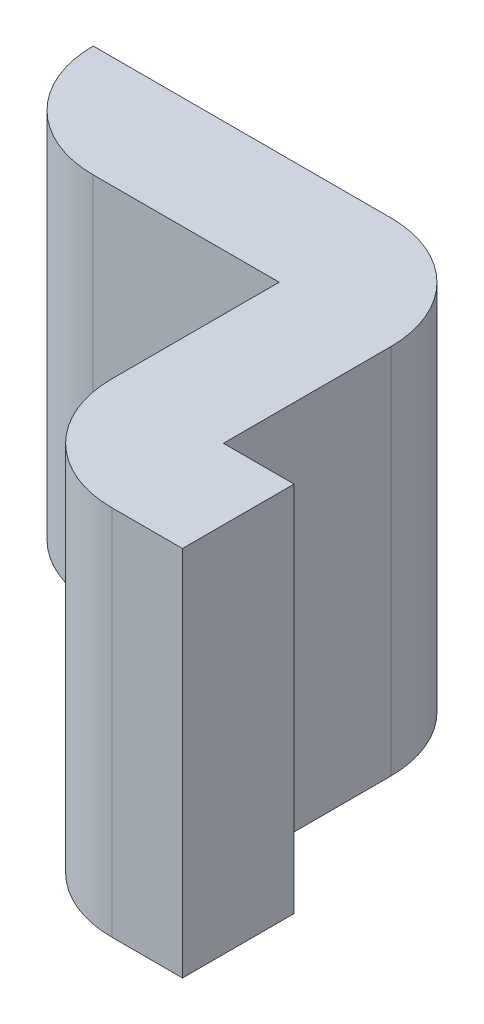
ISO-10303-21;
HEADER;
FILE_DESCRIPTION(('STEP AP214'),'2;1');
FILE_NAME('part.step','',(''),(''),'','','');
FILE_SCHEMA(('AUTOMOTIVE_DESIGN { 1 0 10303 214 1 1 1 1 }'));
ENDSEC;
DATA;
#1=APPLICATION_CONTEXT('core data for automotive mechanical design processes');
#2=APPLICATION_PROTOCOL_DEFINITION('international standard','automotive_design',2000,#1);
#3=PRODUCT_CONTEXT('',#1,'mechanical');
#4=PRODUCT('Part','Part','',(#3));
#5=PRODUCT_RELATED_PRODUCT_CATEGORY('part','',(#4));
#6=PRODUCT_DEFINITION_FORMATION('','',#4);
#7=PRODUCT_DEFINITION_CONTEXT('part definition',#1,'design');
#8=PRODUCT_DEFINITION('design','',#6,#7);
#9=PRODUCT_DEFINITION_SHAPE('','',#8);
#10=(LENGTH_UNIT() NAMED_UNIT(*) SI_UNIT(.MILLI.,.METRE.));
#11=(NAMED_UNIT(*) PLANE_ANGLE_UNIT() SI_UNIT($,.RADIAN.));
#12=(NAMED_UNIT(*) SI_UNIT($,.STERADIAN.) SOLID_ANGLE_UNIT());
#13=UNCERTAINTY_MEASURE_WITH_UNIT(LENGTH_MEASURE(1.E-05),#10,'distance_accuracy_value','');
#14=(GEOMETRIC_REPRESENTATION_CONTEXT(3) GLOBAL_UNCERTAINTY_ASSIGNED_CONTEXT((#13)) GLOBAL_UNIT_ASSIGNED_CONTEXT((#10,
#11,#12)) REPRESENTATION_CONTEXT('',''));
#15=CARTESIAN_POINT('',(0.,0.,0.));
#16=DIRECTION('',(0.,0.,1.));
#17=DIRECTION('',(1.,0.,0.));
#18=AXIS2_PLACEMENT_3D('',#15,#16,#17);
#19=CARTESIAN_POINT('',(1.2065,5.6642,0.9525));
#20=DIRECTION('',(-1.,0.,0.));
#21=DIRECTION('',(0.,0.,1.));
#22=AXIS2_PLACEMENT_3D('',#19,#20,#21);
#23=PLANE('',#22);
#24=DIRECTION('',(0.,-1.,0.));
#25=VECTOR('',#24,1.);
#26=CARTESIAN_POINT('',(1.2065,5.6642,0.381));
#27=LINE('',#26,#25);
#28=CARTESIAN_POINT('',(1.2065,6.9342,0.381));
#29=VERTEX_POINT('',#28);
#30=CARTESIAN_POINT('',(1.2065,5.6642,0.381));
#31=VERTEX_POINT('',#30);
#32=EDGE_CURVE('E83',#29,#31,#27,.T.);
#33=ORIENTED_EDGE('',*,*,#32,.F.);
#34=DIRECTION('',(0.,0.,-1.));
#35=VECTOR('',#34,1.);
#36=CARTESIAN_POINT('',(1.2065,6.9342,0.));
#37=LINE('',#36,#35);
#38=CARTESIAN_POINT('',(1.2065,6.9342,0.9525));
#39=VERTEX_POINT('',#38);
#40=EDGE_CURVE('E80',#29,#39,#37,.F.);
#41=ORIENTED_EDGE('',*,*,#40,.T.);
#42=DIRECTION('',(0.,1.,0.));
#43=VECTOR('',#42,1.);
#44=CARTESIAN_POINT('',(1.2065,5.6642,0.9525));
#45=LINE('',#44,#43);
#46=CARTESIAN_POINT('',(1.2065,5.6642,0.9525));
#47=VERTEX_POINT('',#46);
#48=EDGE_CURVE('E148',#39,#47,#45,.F.);
#49=ORIENTED_EDGE('',*,*,#48,.T.);
#50=DIRECTION('',(0.,0.,-1.));
#51=VECTOR('',#50,1.);
#52=CARTESIAN_POINT('',(1.2065,5.6642,0.));
#53=LINE('',#52,#51);
#54=EDGE_CURVE('E153',#31,#47,#53,.F.);
#55=ORIENTED_EDGE('',*,*,#54,.F.);
#56=EDGE_LOOP('',(#33,#41,#49,#55));
#57=FACE_BOUND('',#56,.T.);
#58=ADVANCED_FACE('F17',(#57),#23,.F.);
#59=CARTESIAN_POINT('',(1.4478,5.6642,0.9525));
#60=DIRECTION('',(0.,0.,1.));
#61=DIRECTION('',(1.,0.,0.));
#62=AXIS2_PLACEMENT_3D('',#59,#60,#61);
#63=PLANE('',#62);
#64=ORIENTED_EDGE('',*,*,#48,.F.);
#65=DIRECTION('',(1.,0.,0.));
#66=VECTOR('',#65,1.);
#67=CARTESIAN_POINT('',(-0.1905,6.9342,0.9525));
#68=LINE('',#67,#66);
#69=CARTESIAN_POINT('',(1.4478,6.9342,0.9525));
#70=VERTEX_POINT('',#69);
#71=EDGE_CURVE('E118',#39,#70,#68,.T.);
#72=ORIENTED_EDGE('',*,*,#71,.T.);
#73=DIRECTION('',(0.,1.,0.));
#74=VECTOR('',#73,1.);
#75=CARTESIAN_POINT('',(1.4478,5.6642,0.9525));
#76=LINE('',#75,#74);
#77=CARTESIAN_POINT('',(1.4478,5.6642,0.9525));
#78=VERTEX_POINT('',#77);
#79=EDGE_CURVE('E136',#70,#78,#76,.F.);
#80=ORIENTED_EDGE('',*,*,#79,.T.);
#81=DIRECTION('',(1.,0.,0.));
#82=VECTOR('',#81,1.);
#83=CARTESIAN_POINT('',(-0.1905,5.6642,0.9525));
#84=LINE('',#83,#82);
#85=EDGE_CURVE('E143',#47,#78,#84,.T.);
#86=ORIENTED_EDGE('',*,*,#85,.F.);
#87=EDGE_LOOP('',(#64,#72,#80,#86));
#88=FACE_BOUND('',#87,.T.);
#89=ADVANCED_FACE('F315',(#88),#63,.F.);
#90=CARTESIAN_POINT('',(1.4478,5.6642,1.3335));
#91=DIRECTION('',(-1.,0.,0.));
#92=DIRECTION('',(0.,0.,1.));
#93=AXIS2_PLACEMENT_3D('',#90,#91,#92);
#94=PLANE('',#93);
#95=ORIENTED_EDGE('',*,*,#79,.F.);
#96=DIRECTION('',(0.,0.,-1.));
#97=VECTOR('',#96,1.);
#98=CARTESIAN_POINT('',(1.4478,6.9342,0.));
#99=LINE('',#98,#97);
#100=CARTESIAN_POINT('',(1.4478,6.9342,1.3335));
#101=VERTEX_POINT('',#100);
#102=EDGE_CURVE('E114',#70,#101,#99,.F.);
#103=ORIENTED_EDGE('',*,*,#102,.T.);
#104=DIRECTION('',(0.,1.,0.));
#105=VECTOR('',#104,1.);
#106=CARTESIAN_POINT('',(1.4478,5.6642,1.3335));
#107=LINE('',#106,#105);
#108=CARTESIAN_POINT('',(1.4478,5.6642,1.3335));
#109=VERTEX_POINT('',#108);
#110=EDGE_CURVE('E133',#101,#109,#107,.F.);
#111=ORIENTED_EDGE('',*,*,#110,.T.);
#112=DIRECTION('',(0.,0.,-1.));
#113=VECTOR('',#112,1.);
#114=CARTESIAN_POINT('',(1.4478,5.6642,0.));
#115=LINE('',#114,#113);
#116=EDGE_CURVE('E139',#78,#109,#115,.F.);
#117=ORIENTED_EDGE('',*,*,#116,.F.);
#118=EDGE_LOOP('',(#95,#103,#111,#117));
#119=FACE_BOUND('',#118,.T.);
#120=ADVANCED_FACE('F192',(#119),#94,.F.);
#121=CARTESIAN_POINT('',(1.2065,5.6642,1.3335));
#122=DIRECTION('',(0.,0.,-1.));
#123=DIRECTION('',(-1.,0.,0.));
#124=AXIS2_PLACEMENT_3D('',#121,#122,#123);
#125=PLANE('',#124);
#126=ORIENTED_EDGE('',*,*,#110,.F.);
#127=DIRECTION('',(1.,0.,0.));
#128=VECTOR('',#127,1.);
#129=CARTESIAN_POINT('',(-0.1905,6.9342,1.3335));
#130=LINE('',#129,#128);
#131=CARTESIAN_POINT('',(1.2065,6.9342,1.3335));
#132=VERTEX_POINT('',#131);
#133=EDGE_CURVE('E111',#101,#132,#130,.F.);
#134=ORIENTED_EDGE('',*,*,#133,.T.);
#135=DIRECTION('',(0.,-1.,0.));
#136=VECTOR('',#135,1.);
#137=CARTESIAN_POINT('',(1.2065,5.6642,1.3335));
#138=LINE('',#137,#136);
#139=CARTESIAN_POINT('',(1.2065,5.6642,1.3335));
#140=VERTEX_POINT('',#139);
#141=EDGE_CURVE('E131',#140,#132,#138,.F.);
#142=ORIENTED_EDGE('',*,*,#141,.F.);
#143=DIRECTION('',(1.,0.,0.));
#144=VECTOR('',#143,1.);
#145=CARTESIAN_POINT('',(-0.1905,5.6642,1.3335));
#146=LINE('',#145,#144);
#147=EDGE_CURVE('E142',#109,#140,#146,.F.);
#148=ORIENTED_EDGE('',*,*,#147,.F.);
#149=EDGE_LOOP('',(#126,#134,#142,#148));
#150=FACE_BOUND('',#149,.T.);
#151=ADVANCED_FACE('F185',(#150),#125,.F.);
#152=CARTESIAN_POINT('',(1.2065,5.6642,0.9525));
#153=DIRECTION('',(0.,-1.,0.));
#154=DIRECTION('',(0.,0.,-1.));
#155=AXIS2_PLACEMENT_3D('',#152,#153,#154);
#156=CYLINDRICAL_SURFACE('',#155,0.381);
#157=CARTESIAN_POINT('',(1.2065,6.9342,0.9525));
#158=DIRECTION('',(0.,-1.,0.));
#159=DIRECTION('',(0.,0.,-1.));
#160=AXIS2_PLACEMENT_3D('',#157,#158,#159);
#161=CIRCLE('',#160,0.381);
#162=CARTESIAN_POINT('',(0.8255,6.9342,0.9525));
#163=VERTEX_POINT('',#162);
#164=EDGE_CURVE('E108',#132,#163,#161,.T.);
#165=ORIENTED_EDGE('',*,*,#164,.T.);
#166=DIRECTION('',(0.,1.,0.));
#167=VECTOR('',#166,1.);
#168=CARTESIAN_POINT('',(0.8255,5.6642,0.9525));
#169=LINE('',#168,#167);
#170=CARTESIAN_POINT('',(0.8255,5.6642,0.9525));
#171=VERTEX_POINT('',#170);
#172=EDGE_CURVE('E126',#163,#171,#169,.F.);
#173=ORIENTED_EDGE('',*,*,#172,.T.);
#174=CARTESIAN_POINT('',(1.2065,5.6642,0.9525));
#175=DIRECTION('',(0.,-1.,0.));
#176=DIRECTION('',(0.,0.,-1.));
#177=AXIS2_PLACEMENT_3D('',#174,#175,#176);
#178=CIRCLE('',#177,0.381);
#179=EDGE_CURVE('E169',#140,#171,#178,.T.);
#180=ORIENTED_EDGE('',*,*,#179,.F.);
#181=ORIENTED_EDGE('',*,*,#141,.T.);
#182=EDGE_LOOP('',(#165,#173,#180,#181));
#183=FACE_BOUND('',#182,.T.);
#184=ADVANCED_FACE('F176',(#183),#156,.T.);
#185=CARTESIAN_POINT('',(0.8255,5.6642,0.381));
#186=DIRECTION('',(1.,0.,0.));
#187=DIRECTION('',(0.,0.,-1.));
#188=AXIS2_PLACEMENT_3D('',#185,#186,#187);
#189=PLANE('',#188);
#190=ORIENTED_EDGE('',*,*,#172,.F.);
#191=DIRECTION('',(0.,0.,-1.));
#192=VECTOR('',#191,1.);
#193=CARTESIAN_POINT('',(0.8255,6.9342,0.));
#194=LINE('',#193,#192);
#195=CARTESIAN_POINT('',(0.8255,6.9342,0.381));
#196=VERTEX_POINT('',#195);
#197=EDGE_CURVE('E103',#163,#196,#194,.T.);
#198=ORIENTED_EDGE('',*,*,#197,.T.);
#199=DIRECTION('',(0.,1.,0.));
#200=VECTOR('',#199,1.);
#201=CARTESIAN_POINT('',(0.8255,5.6642,0.381));
#202=LINE('',#201,#200);
#203=CARTESIAN_POINT('',(0.8255,5.6642,0.381));
#204=VERTEX_POINT('',#203);
#205=EDGE_CURVE('E123',#196,#204,#202,.F.);
#206=ORIENTED_EDGE('',*,*,#205,.T.);
#207=DIRECTION('',(0.,0.,-1.));
#208=VECTOR('',#207,1.);
#209=CARTESIAN_POINT('',(0.8255,5.6642,0.));
#210=LINE('',#209,#208);
#211=EDGE_CURVE('E171',#171,#204,#210,.T.);
#212=ORIENTED_EDGE('',*,*,#211,.F.);
#213=EDGE_LOOP('',(#190,#198,#206,#212));
#214=FACE_BOUND('',#213,.T.);
#215=ADVANCED_FACE('F230',(#214),#189,.F.);
#216=CARTESIAN_POINT('',(0.1905,5.6642,0.381));
#217=DIRECTION('',(0.,0.,-1.));
#218=DIRECTION('',(-1.,0.,0.));
#219=AXIS2_PLACEMENT_3D('',#216,#217,#218);
#220=PLANE('',#219);
#221=ORIENTED_EDGE('',*,*,#205,.F.);
#222=DIRECTION('',(1.,0.,0.));
#223=VECTOR('',#222,1.);
#224=CARTESIAN_POINT('',(-0.1905,6.9342,0.381));
#225=LINE('',#224,#223);
#226=CARTESIAN_POINT('',(0.1905,6.9342,0.381));
#227=VERTEX_POINT('',#226);
#228=EDGE_CURVE('E99',#196,#227,#225,.F.);
#229=ORIENTED_EDGE('',*,*,#228,.T.);
#230=DIRECTION('',(0.,-1.,0.));
#231=VECTOR('',#230,1.);
#232=CARTESIAN_POINT('',(0.1905,5.6642,0.381));
#233=LINE('',#232,#231);
#234=CARTESIAN_POINT('',(0.1905,5.6642,0.381));
#235=VERTEX_POINT('',#234);
#236=EDGE_CURVE('E102',#235,#227,#233,.F.);
#237=ORIENTED_EDGE('',*,*,#236,.F.);
#238=DIRECTION('',(1.,0.,0.));
#239=VECTOR('',#238,1.);
#240=CARTESIAN_POINT('',(-0.1905,5.6642,0.381));
#241=LINE('',#240,#239);
#242=EDGE_CURVE('E95',#204,#235,#241,.F.);
#243=ORIENTED_EDGE('',*,*,#242,.F.);
#244=EDGE_LOOP('',(#221,#229,#237,#243));
#245=FACE_BOUND('',#244,.T.);
#246=ADVANCED_FACE('F228',(#245),#220,.F.);
#247=CARTESIAN_POINT('',(0.8255,5.6642,0.381));
#248=DIRECTION('',(0.,-1.,0.));
#249=DIRECTION('',(0.,0.,-1.));
#250=AXIS2_PLACEMENT_3D('',#247,#248,#249);
#251=CYLINDRICAL_SURFACE('',#250,0.381);
#252=CARTESIAN_POINT('',(0.8255,6.9342,0.381));
#253=DIRECTION('',(0.,-1.,0.));
#254=DIRECTION('',(0.,0.,-1.));
#255=AXIS2_PLACEMENT_3D('',#252,#253,#254);
#256=CIRCLE('',#255,0.381);
#257=CARTESIAN_POINT('',(0.8255,6.9342,0.));
#258=VERTEX_POINT('',#257);
#259=EDGE_CURVE('E20',#258,#29,#256,.T.);
#260=ORIENTED_EDGE('',*,*,#259,.T.);
#261=ORIENTED_EDGE('',*,*,#32,.T.);
#262=CARTESIAN_POINT('',(0.8255,5.6642,0.381));
#263=DIRECTION('',(0.,-1.,0.));
#264=DIRECTION('',(0.,0.,-1.));
#265=AXIS2_PLACEMENT_3D('',#262,#263,#264);
#266=CIRCLE('',#265,0.381);
#267=CARTESIAN_POINT('',(0.8255,5.6642,0.));
#268=VERTEX_POINT('',#267);
#269=EDGE_CURVE('E93',#268,#31,#266,.T.);
#270=ORIENTED_EDGE('',*,*,#269,.F.);
#271=DIRECTION('',(0.,1.,0.));
#272=VECTOR('',#271,1.);
#273=CARTESIAN_POINT('',(0.8255,5.6642,0.));
#274=LINE('',#273,#272);
#275=EDGE_CURVE('E87',#268,#258,#274,.T.);
#276=ORIENTED_EDGE('',*,*,#275,.T.);
#277=EDGE_LOOP('',(#260,#261,#270,#276));
#278=FACE_BOUND('',#277,.T.);
#279=ADVANCED_FACE('F91',(#278),#251,.T.);
#280=CARTESIAN_POINT('',(-0.1905,6.9342,0.));
#281=DIRECTION('',(0.,-1.,0.));
#282=DIRECTION('',(0.,0.,-1.));
#283=AXIS2_PLACEMENT_3D('',#280,#281,#282);
#284=PLANE('',#283);
#285=ORIENTED_EDGE('',*,*,#228,.F.);
#286=ORIENTED_EDGE('',*,*,#197,.F.);
#287=ORIENTED_EDGE('',*,*,#164,.F.);
#288=ORIENTED_EDGE('',*,*,#133,.F.);
#289=ORIENTED_EDGE('',*,*,#102,.F.);
#290=ORIENTED_EDGE('',*,*,#71,.F.);
#291=ORIENTED_EDGE('',*,*,#40,.F.);
#292=ORIENTED_EDGE('',*,*,#259,.F.);
#293=DIRECTION('',(1.,0.,0.));
#294=VECTOR('',#293,1.);
#295=CARTESIAN_POINT('',(0.8255,6.9342,0.));
#296=LINE('',#295,#294);
#297=CARTESIAN_POINT('',(-0.1905,6.9342,0.));
#298=VERTEX_POINT('',#297);
#299=EDGE_CURVE('E77',#258,#298,#296,.F.);
#300=ORIENTED_EDGE('',*,*,#299,.T.);
#301=CARTESIAN_POINT('',(0.1905,6.9342,0.));
#302=DIRECTION('',(0.,-1.,0.));
#303=DIRECTION('',(0.,0.,-1.));
#304=AXIS2_PLACEMENT_3D('',#301,#302,#303);
#305=CIRCLE('',#304,0.381);
#306=EDGE_CURVE('E122',#227,#298,#305,.T.);
#307=ORIENTED_EDGE('',*,*,#306,.F.);
#308=EDGE_LOOP('',(#285,#286,#287,#288,#289,#290,#291,#292,#300,#307));
#309=FACE_BOUND('',#308,.T.);
#310=ADVANCED_FACE('F75',(#309),#284,.F.);
#311=CARTESIAN_POINT('',(0.1905,5.6642,0.));
#312=DIRECTION('',(0.,-1.,0.));
#313=DIRECTION('',(0.,0.,-1.));
#314=AXIS2_PLACEMENT_3D('',#311,#312,#313);
#315=CYLINDRICAL_SURFACE('',#314,0.381);
#316=ORIENTED_EDGE('',*,*,#306,.T.);
#317=DIRECTION('',(0.,1.,0.));
#318=VECTOR('',#317,1.);
#319=CARTESIAN_POINT('',(-0.1905,5.6642,0.));
#320=LINE('',#319,#318);
#321=CARTESIAN_POINT('',(-0.1905,5.6642,0.));
#322=VERTEX_POINT('',#321);
#323=EDGE_CURVE('E26',#298,#322,#320,.F.);
#324=ORIENTED_EDGE('',*,*,#323,.T.);
#325=CARTESIAN_POINT('',(0.1905,5.6642,0.));
#326=DIRECTION('',(0.,-1.,0.));
#327=DIRECTION('',(0.,0.,-1.));
#328=AXIS2_PLACEMENT_3D('',#325,#326,#327);
#329=CIRCLE('',#328,0.381);
#330=EDGE_CURVE('E34',#235,#322,#329,.T.);
#331=ORIENTED_EDGE('',*,*,#330,.F.);
#332=ORIENTED_EDGE('',*,*,#236,.T.);
#333=EDGE_LOOP('',(#316,#324,#331,#332));
#334=FACE_BOUND('',#333,.T.);
#335=ADVANCED_FACE('F210',(#334),#315,.T.);
#336=CARTESIAN_POINT('',(-0.1905,5.6642,0.));
#337=DIRECTION('',(0.,-1.,0.));
#338=DIRECTION('',(0.,0.,-1.));
#339=AXIS2_PLACEMENT_3D('',#336,#337,#338);
#340=PLANE('',#339);
#341=ORIENTED_EDGE('',*,*,#242,.T.);
#342=ORIENTED_EDGE('',*,*,#330,.T.);
#343=DIRECTION('',(1.,0.,0.));
#344=VECTOR('',#343,1.);
#345=CARTESIAN_POINT('',(0.8255,5.6642,0.));
#346=LINE('',#345,#344);
#347=EDGE_CURVE('E11',#322,#268,#346,.T.);
#348=ORIENTED_EDGE('',*,*,#347,.T.);
#349=ORIENTED_EDGE('',*,*,#269,.T.);
#350=ORIENTED_EDGE('',*,*,#54,.T.);
#351=ORIENTED_EDGE('',*,*,#85,.T.);
#352=ORIENTED_EDGE('',*,*,#116,.T.);
#353=ORIENTED_EDGE('',*,*,#147,.T.);
#354=ORIENTED_EDGE('',*,*,#179,.T.);
#355=ORIENTED_EDGE('',*,*,#211,.T.);
#356=EDGE_LOOP('',(#341,#342,#348,#349,#350,#351,#352,#353,#354,#355));
#357=FACE_BOUND('',#356,.T.);
#358=ADVANCED_FACE('F208',(#357),#340,.T.);
#359=CARTESIAN_POINT('',(0.8255,5.6642,0.));
#360=DIRECTION('',(0.,0.,1.));
#361=DIRECTION('',(1.,0.,0.));
#362=AXIS2_PLACEMENT_3D('',#359,#360,#361);
#363=PLANE('',#362);
#364=ORIENTED_EDGE('',*,*,#323,.F.);
#365=ORIENTED_EDGE('',*,*,#299,.F.);
#366=ORIENTED_EDGE('',*,*,#275,.F.);
#367=ORIENTED_EDGE('',*,*,#347,.F.);
#368=EDGE_LOOP('',(#364,#365,#366,#367));
#369=FACE_BOUND('',#368,.T.);
#370=ADVANCED_FACE('F86',(#369),#363,.F.);
#371=CLOSED_SHELL('',(#58,#89,#120,#151,#184,#215,#246,#279,#310,#335,#358,#370));
#372=MANIFOLD_SOLID_BREP('B1',#371);
#373=ADVANCED_BREP_SHAPE_REPRESENTATION('',(#18,#372),#14);
#374=SHAPE_DEFINITION_REPRESENTATION(#9,#373);
ENDSEC;
END-ISO-10303-21;
